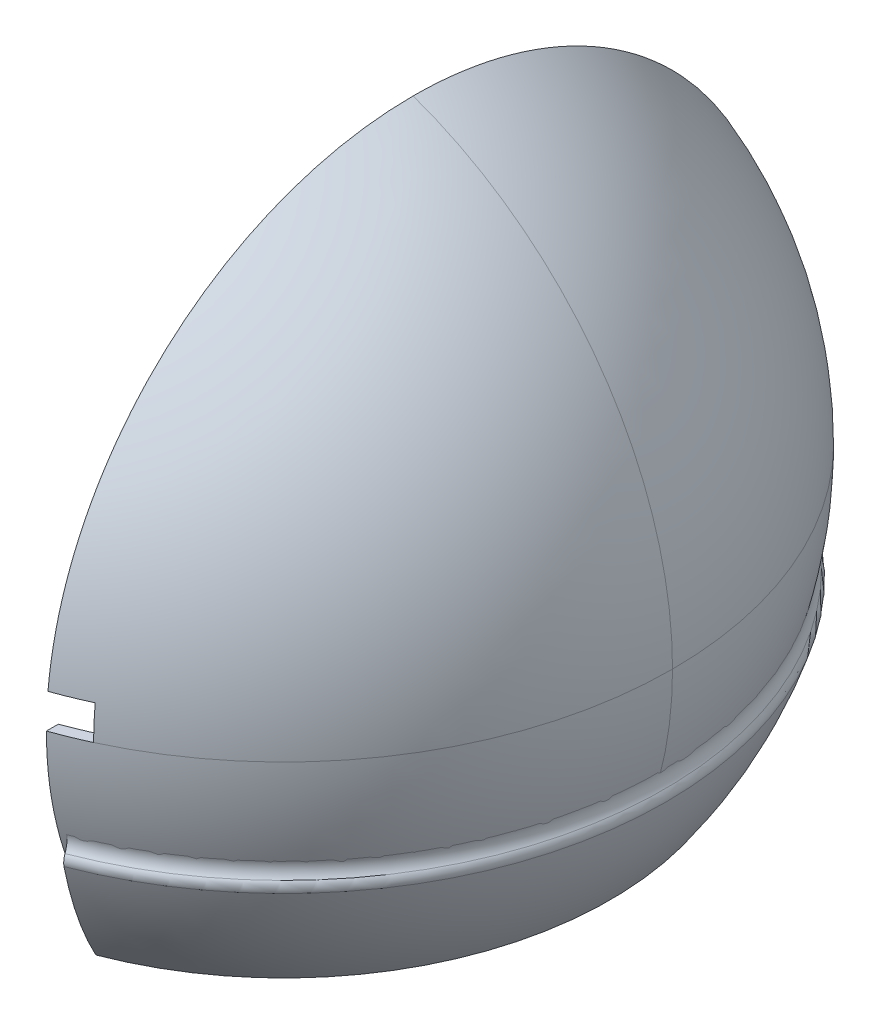
ISO-10303-21;
HEADER;
FILE_DESCRIPTION(('STEP AP214'),'2;1');
FILE_NAME('part.step','',(''),(''),'','','');
FILE_SCHEMA(('AUTOMOTIVE_DESIGN { 1 0 10303 214 1 1 1 1 }'));
ENDSEC;
DATA;
#1=APPLICATION_CONTEXT('core data for automotive mechanical design processes');
#2=APPLICATION_PROTOCOL_DEFINITION('international standard','automotive_design',2000,#1);
#3=PRODUCT_CONTEXT('',#1,'mechanical');
#4=PRODUCT('Part','Part','',(#3));
#5=PRODUCT_RELATED_PRODUCT_CATEGORY('part','',(#4));
#6=PRODUCT_DEFINITION_FORMATION('','',#4);
#7=PRODUCT_DEFINITION_CONTEXT('part definition',#1,'design');
#8=PRODUCT_DEFINITION('design','',#6,#7);
#9=PRODUCT_DEFINITION_SHAPE('','',#8);
#10=(LENGTH_UNIT() NAMED_UNIT(*) SI_UNIT(.MILLI.,.METRE.));
#11=(NAMED_UNIT(*) PLANE_ANGLE_UNIT() SI_UNIT($,.RADIAN.));
#12=(NAMED_UNIT(*) SI_UNIT($,.STERADIAN.) SOLID_ANGLE_UNIT());
#13=UNCERTAINTY_MEASURE_WITH_UNIT(LENGTH_MEASURE(1.E-05),#10,'distance_accuracy_value','');
#14=(GEOMETRIC_REPRESENTATION_CONTEXT(3) GLOBAL_UNCERTAINTY_ASSIGNED_CONTEXT((#13)) GLOBAL_UNIT_ASSIGNED_CONTEXT((#10,
#11,#12)) REPRESENTATION_CONTEXT('',''));
#15=CARTESIAN_POINT('',(0.,0.,0.));
#16=DIRECTION('',(0.,0.,1.));
#17=DIRECTION('',(1.,0.,0.));
#18=AXIS2_PLACEMENT_3D('',#15,#16,#17);
#19=CARTESIAN_POINT('',(0.,0.,0.));
#20=DIRECTION('',(0.,-1.,0.));
#21=DIRECTION('',(0.358367949545273,0.,-0.933580426497212));
#22=AXIS2_PLACEMENT_3D('',#19,#20,#21);
#23=SPHERICAL_SURFACE('',#22,69.5);
#24=CARTESIAN_POINT('',(0.,-40.1519259480426,0.));
#25=DIRECTION('',(0.,-1.,0.));
#26=DIRECTION('',(0.,0.,-1.));
#27=AXIS2_PLACEMENT_3D('',#24,#25,#26);
#28=CIRCLE('',#27,56.728060452151);
#29=CARTESIAN_POINT('',(20.3295187059177,-40.1519259480426,-52.9602068712788));
#30=VERTEX_POINT('',#29);
#31=CARTESIAN_POINT('',(20.3295187059177,-40.1519259480426,52.9602068712788));
#32=VERTEX_POINT('',#31);
#33=EDGE_CURVE('E109',#30,#32,#28,.T.);
#34=ORIENTED_EDGE('',*,*,#33,.T.);
#35=CARTESIAN_POINT('',(0.,0.,0.));
#36=DIRECTION('',(0.933580426497212,0.,-0.358367949545273));
#37=DIRECTION('',(0.358367949545273,0.,0.933580426497212));
#38=AXIS2_PLACEMENT_3D('',#35,#36,#37);
#39=CIRCLE('',#38,69.5);
#40=CARTESIAN_POINT('',(24.1654577946896,-16.8279248908308,62.953169844271));
#41=VERTEX_POINT('',#40);
#42=EDGE_CURVE('E97',#41,#32,#39,.T.);
#43=ORIENTED_EDGE('',*,*,#42,.F.);
#44=CARTESIAN_POINT('',(0.,-16.8279248908308,0.));
#45=DIRECTION('',(0.,-1.,0.));
#46=DIRECTION('',(0.,0.,-1.));
#47=AXIS2_PLACEMENT_3D('',#44,#45,#46);
#48=CIRCLE('',#47,67.4319727122717);
#49=CARTESIAN_POINT('',(24.1654577946896,-16.8279248908308,-62.953169844271));
#50=VERTEX_POINT('',#49);
#51=EDGE_CURVE('E132',#50,#41,#48,.T.);
#52=ORIENTED_EDGE('',*,*,#51,.F.);
#53=CARTESIAN_POINT('',(0.,0.,0.));
#54=DIRECTION('',(-0.933580426497212,0.,-0.358367949545273));
#55=DIRECTION('',(0.358367949545273,0.,-0.933580426497212));
#56=AXIS2_PLACEMENT_3D('',#53,#54,#55);
#57=CIRCLE('',#56,69.5);
#58=EDGE_CURVE('E111',#50,#30,#57,.T.);
#59=ORIENTED_EDGE('',*,*,#58,.T.);
#60=EDGE_LOOP('',(#34,#43,#52,#59));
#61=FACE_BOUND('',#60,.T.);
#62=ADVANCED_FACE('F53',(#61),#23,.F.);
#63=CARTESIAN_POINT('',(0.,-40.1519259480426,0.));
#64=DIRECTION('',(0.,-1.,0.));
#65=DIRECTION('',(0.,0.,-1.));
#66=AXIS2_PLACEMENT_3D('',#63,#64,#65);
#67=CONICAL_SURFACE('',#66,56.728060452151,0.954856916214975);
#68=CARTESIAN_POINT('',(0.,-41.3073770544612,0.));
#69=DIRECTION('',(0.,-1.,0.));
#70=DIRECTION('',(0.,0.,-1.));
#71=AXIS2_PLACEMENT_3D('',#68,#69,#70);
#72=CIRCLE('',#71,58.3605226234359);
#73=CARTESIAN_POINT('',(20.9145408269513,-41.3073770544612,-54.4842416013875));
#74=VERTEX_POINT('',#73);
#75=CARTESIAN_POINT('',(20.9145408269513,-41.3073770544612,54.4842416013875));
#76=VERTEX_POINT('',#75);
#77=EDGE_CURVE('E116',#74,#76,#72,.T.);
#78=ORIENTED_EDGE('',*,*,#77,.T.);
#79=DIRECTION('',(0.292511060516796,-0.577725553209265,0.762017365054359));
#80=VECTOR('',#79,1.);
#81=CARTESIAN_POINT('',(20.3295187059177,-40.1519259480427,52.9602068712788));
#82=LINE('',#81,#80);
#83=EDGE_CURVE('E101',#32,#76,#82,.T.);
#84=ORIENTED_EDGE('',*,*,#83,.F.);
#85=ORIENTED_EDGE('',*,*,#33,.F.);
#86=DIRECTION('',(0.292511060516796,-0.577725553209265,-0.762017365054359));
#87=VECTOR('',#86,1.);
#88=CARTESIAN_POINT('',(20.3295187059177,-40.1519259480427,-52.9602068712788));
#89=LINE('',#88,#87);
#90=EDGE_CURVE('E125',#30,#74,#89,.T.);
#91=ORIENTED_EDGE('',*,*,#90,.T.);
#92=EDGE_LOOP('',(#78,#84,#85,#91));
#93=FACE_BOUND('',#92,.T.);
#94=ADVANCED_FACE('F118',(#93),#67,.F.);
#95=CARTESIAN_POINT('',(0.,0.,0.));
#96=DIRECTION('',(0.,-1.,0.));
#97=DIRECTION('',(0.358367949545273,0.,-0.933580426497212));
#98=AXIS2_PLACEMENT_3D('',#95,#96,#97);
#99=SPHERICAL_SURFACE('',#98,71.5);
#100=CARTESIAN_POINT('',(0.,0.,0.));
#101=DIRECTION('',(0.933580426497212,0.,0.358367949545273));
#102=DIRECTION('',(-0.358367949545273,0.,0.933580426497212));
#103=AXIS2_PLACEMENT_3D('',#100,#101,#102);
#104=CIRCLE('',#103,71.5);
#105=CARTESIAN_POINT('',(24.4694732451505,-21.2143775894294,-63.7451571697645));
#106=VERTEX_POINT('',#105);
#107=EDGE_CURVE('E127',#74,#106,#104,.T.);
#108=ORIENTED_EDGE('',*,*,#107,.T.);
#109=CARTESIAN_POINT('',(0.,-21.2143775894294,0.));
#110=DIRECTION('',(0.,1.,0.));
#111=DIRECTION('',(0.,0.,1.));
#112=AXIS2_PLACEMENT_3D('',#109,#110,#111);
#113=CIRCLE('',#112,68.2803059709981);
#114=CARTESIAN_POINT('',(24.4694732451505,-21.2143775894294,63.7451571697645));
#115=VERTEX_POINT('',#114);
#116=EDGE_CURVE('E115',#106,#115,#113,.F.);
#117=ORIENTED_EDGE('',*,*,#116,.T.);
#118=CARTESIAN_POINT('',(0.,0.,0.));
#119=DIRECTION('',(-0.933580426497212,0.,0.358367949545273));
#120=DIRECTION('',(-0.358367949545273,0.,-0.933580426497212));
#121=AXIS2_PLACEMENT_3D('',#118,#119,#120);
#122=CIRCLE('',#121,71.5);
#123=EDGE_CURVE('E119',#76,#115,#122,.T.);
#124=ORIENTED_EDGE('',*,*,#123,.F.);
#125=ORIENTED_EDGE('',*,*,#77,.F.);
#126=EDGE_LOOP('',(#108,#117,#124,#125));
#127=FACE_BOUND('',#126,.T.);
#128=ADVANCED_FACE('F139',(#127),#99,.T.);
#129=CARTESIAN_POINT('',(0.,-17.56609752028,0.));
#130=DIRECTION('',(0.,-1.,0.));
#131=DIRECTION('',(0.,0.,-1.));
#132=AXIS2_PLACEMENT_3D('',#129,#130,#131);
#133=TOROIDAL_SURFACE('',#132,70.3899391239881,3.04868235861166);
#134=CARTESIAN_POINT('',(25.2254981524802,-17.56609752028,65.7146693884856));
#135=DIRECTION('',(0.933580426497212,0.,-0.358367949545273));
#136=DIRECTION('',(-0.358367949545273,0.,-0.933580426497212));
#137=AXIS2_PLACEMENT_3D('',#134,#135,#136);
#138=CIRCLE('',#137,3.04868235861166);
#139=CARTESIAN_POINT('',(24.355650730605,-19.410802807093,63.4486393818062));
#140=VERTEX_POINT('',#139);
#141=EDGE_CURVE('E103',#140,#41,#138,.T.);
#142=ORIENTED_EDGE('',*,*,#141,.F.);
#143=CARTESIAN_POINT('',(0.,-19.4108028070928,0.));
#144=DIRECTION('',(0.,1.,0.));
#145=DIRECTION('',(0.,0.,1.));
#146=AXIS2_PLACEMENT_3D('',#143,#144,#145);
#147=CIRCLE('',#146,67.9626924269025);
#148=CARTESIAN_POINT('',(24.355650730605,-19.410802807093,-63.4486393818062));
#149=VERTEX_POINT('',#148);
#150=EDGE_CURVE('E61',#140,#149,#147,.T.);
#151=ORIENTED_EDGE('',*,*,#150,.T.);
#152=CARTESIAN_POINT('',(25.2254981524802,-17.56609752028,-65.7146693884856));
#153=DIRECTION('',(-0.933580426497212,0.,-0.358367949545273));
#154=DIRECTION('',(-0.358367949545273,0.,0.933580426497212));
#155=AXIS2_PLACEMENT_3D('',#152,#153,#154);
#156=CIRCLE('',#155,3.04868235861166);
#157=EDGE_CURVE('E130',#149,#50,#156,.T.);
#158=ORIENTED_EDGE('',*,*,#157,.T.);
#159=ORIENTED_EDGE('',*,*,#51,.T.);
#160=EDGE_LOOP('',(#142,#151,#158,#159));
#161=FACE_BOUND('',#160,.T.);
#162=ADVANCED_FACE('F145',(#161),#133,.F.);
#163=CARTESIAN_POINT('',(0.,0.,0.));
#164=DIRECTION('',(0.933580426497212,0.,0.358367949545273));
#165=DIRECTION('',(0.358367949545273,0.,-0.933580426497212));
#166=AXIS2_PLACEMENT_3D('',#163,#164,#165);
#167=PLANE('',#166);
#168=ORIENTED_EDGE('',*,*,#157,.F.);
#169=CARTESIAN_POINT('',(23.7850124550764,-20.6209684260888,-61.9620758503307));
#170=DIRECTION('',(0.933580426497212,0.,0.358367949545273));
#171=DIRECTION('',(0.358367949545273,0.,-0.933580426497212));
#172=AXIS2_PLACEMENT_3D('',#169,#170,#171);
#173=CIRCLE('',#172,2.);
#174=EDGE_CURVE('E12',#149,#106,#173,.F.);
#175=ORIENTED_EDGE('',*,*,#174,.T.);
#176=ORIENTED_EDGE('',*,*,#107,.F.);
#177=ORIENTED_EDGE('',*,*,#90,.F.);
#178=ORIENTED_EDGE('',*,*,#58,.F.);
#179=EDGE_LOOP('',(#168,#175,#176,#177,#178));
#180=FACE_BOUND('',#179,.T.);
#181=ADVANCED_FACE('F144',(#180),#167,.F.);
#182=CARTESIAN_POINT('',(0.,0.,0.));
#183=DIRECTION('',(-0.933580426497212,0.,0.358367949545273));
#184=DIRECTION('',(0.358367949545273,0.,0.933580426497212));
#185=AXIS2_PLACEMENT_3D('',#182,#183,#184);
#186=PLANE('',#185);
#187=ORIENTED_EDGE('',*,*,#123,.T.);
#188=CARTESIAN_POINT('',(23.7850124550764,-20.6209684260888,61.9620758503307));
#189=DIRECTION('',(-0.933580426497212,0.,0.358367949545273));
#190=DIRECTION('',(0.358367949545273,0.,0.933580426497212));
#191=AXIS2_PLACEMENT_3D('',#188,#189,#190);
#192=CIRCLE('',#191,2.);
#193=EDGE_CURVE('E75',#115,#140,#192,.T.);
#194=ORIENTED_EDGE('',*,*,#193,.T.);
#195=ORIENTED_EDGE('',*,*,#141,.T.);
#196=ORIENTED_EDGE('',*,*,#42,.T.);
#197=ORIENTED_EDGE('',*,*,#83,.T.);
#198=EDGE_LOOP('',(#187,#194,#195,#196,#197));
#199=FACE_BOUND('',#198,.T.);
#200=ADVANCED_FACE('F99',(#199),#186,.T.);
#201=CARTESIAN_POINT('',(0.,-20.6209684260888,0.));
#202=DIRECTION('',(0.,-1.,0.));
#203=DIRECTION('',(0.,0.,-1.));
#204=AXIS2_PLACEMENT_3D('',#201,#202,#203);
#205=TOROIDAL_SURFACE('',#204,66.3703673424389,2.);
#206=ORIENTED_EDGE('',*,*,#174,.F.);
#207=ORIENTED_EDGE('',*,*,#150,.F.);
#208=ORIENTED_EDGE('',*,*,#193,.F.);
#209=ORIENTED_EDGE('',*,*,#116,.F.);
#210=EDGE_LOOP('',(#206,#207,#208,#209));
#211=FACE_BOUND('',#210,.T.);
#212=ADVANCED_FACE('F55',(#211),#205,.T.);
#213=CLOSED_SHELL('',(#62,#94,#128,#162,#181,#200,#212));
#214=MANIFOLD_SOLID_BREP('B2',#213);
#215=CARTESIAN_POINT('',(23.12669879,63.4145551358409,376.658573777248));
#216=DIRECTION('',(1.,0.,0.));
#217=DIRECTION('',(0.,1.,0.));
#218=AXIS2_PLACEMENT_3D('',#215,#216,#217);
#219=PLANE('',#218);
#220=CARTESIAN_POINT('',(23.12669879,0.,0.));
#221=DIRECTION('',(1.,0.,0.));
#222=DIRECTION('',(0.,1.,0.));
#223=AXIS2_PLACEMENT_3D('',#220,#221,#222);
#224=CIRCLE('',#223,63.414555135841);
#225=CARTESIAN_POINT('',(23.12669879,-20.8431387079252,59.8913129917754));
#226=VERTEX_POINT('',#225);
#227=CARTESIAN_POINT('',(23.12669879,0.,63.414555135841));
#228=VERTEX_POINT('',#227);
#229=EDGE_CURVE('E331',#226,#228,#224,.F.);
#230=ORIENTED_EDGE('',*,*,#229,.F.);
#231=CARTESIAN_POINT('',(23.12669879,-20.8431387079252,59.8913129917754));
#232=CARTESIAN_POINT('',(23.12669879,-20.8680656284986,59.8826375742931));
#233=CARTESIAN_POINT('',(23.12669879,-20.8933429142004,59.8750029414941));
#234=CARTESIAN_POINT('',(23.12669879,-20.9444481619967,59.8618740909284));
#235=CARTESIAN_POINT('',(23.12669879,-20.9702761461037,59.8563799588921));
#236=CARTESIAN_POINT('',(23.12669879,-21.0482549369945,59.8432149104963));
#237=CARTESIAN_POINT('',(23.12669879,-21.1010004928081,59.8388265358631));
#238=CARTESIAN_POINT('',(23.12669879,-21.2064947949738,59.8390256959304));
#239=CARTESIAN_POINT('',(23.12669879,-21.2592435032381,59.8436211377766));
#240=CARTESIAN_POINT('',(23.12669879,-21.3632060592763,59.8616073338399));
#241=CARTESIAN_POINT('',(23.12669879,-21.4144203030802,59.8749957978593));
#242=CARTESIAN_POINT('',(23.12669879,-21.513933991144,59.9100561754452));
#243=CARTESIAN_POINT('',(23.12669879,-21.5622326124902,59.9317304150728));
#244=CARTESIAN_POINT('',(23.12669879,-21.6547064248714,59.9825878976033));
#245=CARTESIAN_POINT('',(23.12669879,-21.6988800442852,60.0117739867332));
#246=CARTESIAN_POINT('',(23.12669879,-21.7837457623825,60.0779823426161));
#247=CARTESIAN_POINT('',(23.12669879,-21.8242318334567,60.1152682718476));
#248=CARTESIAN_POINT('',(23.12669879,-21.8988179587026,60.195739810578));
#249=CARTESIAN_POINT('',(23.12669879,-21.9329173407773,60.238926040163));
#250=CARTESIAN_POINT('',(23.12669879,-21.9960547445567,60.3328692321022));
#251=CARTESIAN_POINT('',(23.12669879,-22.0246374289979,60.3839320011023));
#252=CARTESIAN_POINT('',(23.12669879,-22.0734025695672,60.4899387140656));
#253=CARTESIAN_POINT('',(23.12669879,-22.0935812868851,60.5448843727859));
#254=CARTESIAN_POINT('',(23.12669879,-22.1235268480908,60.6512445160946));
#255=CARTESIAN_POINT('',(23.12669879,-22.1341715091809,60.7024147606305));
#256=CARTESIAN_POINT('',(23.12669879,-22.148371731476,60.8056510367561));
#257=CARTESIAN_POINT('',(23.12669879,-22.1519380361129,60.8577155896292));
#258=CARTESIAN_POINT('',(23.12669879,-22.1519259480426,60.9097843680729));
#259=B_SPLINE_CURVE_WITH_KNOTS('',3,(#231,#232,#233,#234,#235,#236,#237,#238,#239,#240,#241,
#242,#243,#244,#245,#246,#247,#248,#249,#250,#251,#252,#253,#254,#255,#256,#257,#258),
.UNSPECIFIED.,.F.,.F.,(4,2,2,2,2,2,2,2,2,2,2,2,2,4),(0.,0.0791344135977732,0.158271996327442,
0.316233788838244,0.474334674711824,0.632394398539531,0.790498527005648,0.948662649273955,
1.11306485002964,1.27748434178042,1.45228212659569,1.62715759370095,1.78347097047597,
1.93954691498167),.UNSPECIFIED.);
#260=CARTESIAN_POINT('',(23.12669879,-22.1519259480426,60.9097843680729));
#261=VERTEX_POINT('',#260);
#262=EDGE_CURVE('E379',#226,#261,#259,.T.);
#263=ORIENTED_EDGE('',*,*,#262,.T.);
#264=DIRECTION('',(0.,0.,-1.));
#265=VECTOR('',#264,1.);
#266=CARTESIAN_POINT('',(23.12669879,-22.1519259480426,376.658573777248));
#267=LINE('',#266,#265);
#268=CARTESIAN_POINT('',(23.12669879,-22.1519259480426,61.6822339079013));
#269=VERTEX_POINT('',#268);
#270=EDGE_CURVE('E348',#269,#261,#267,.T.);
#271=ORIENTED_EDGE('',*,*,#270,.F.);
#272=CARTESIAN_POINT('',(23.12669879,0.,0.));
#273=DIRECTION('',(1.,0.,0.));
#274=DIRECTION('',(0.,1.,0.));
#275=AXIS2_PLACEMENT_3D('',#272,#273,#274);
#276=CIRCLE('',#275,65.5393454581034);
#277=CARTESIAN_POINT('',(23.12669879,0.,65.5393454581034));
#278=VERTEX_POINT('',#277);
#279=EDGE_CURVE('E361',#269,#278,#276,.F.);
#280=ORIENTED_EDGE('',*,*,#279,.T.);
#281=DIRECTION('',(0.,0.,-1.));
#282=VECTOR('',#281,1.);
#283=CARTESIAN_POINT('',(23.12669879,0.,93.));
#284=LINE('',#283,#282);
#285=EDGE_CURVE('E432',#278,#228,#284,.T.);
#286=ORIENTED_EDGE('',*,*,#285,.T.);
#287=EDGE_LOOP('',(#230,#263,#271,#280,#286));
#288=FACE_BOUND('',#287,.T.);
#289=ADVANCED_FACE('F206',(#288),#219,.F.);
#290=CARTESIAN_POINT('',(23.12669879,-22.1519259480426,-60.9097843680729));
#291=VERTEX_POINT('',#290);
#292=CARTESIAN_POINT('',(23.12669879,-22.1519259480426,-61.6822339079013));
#293=VERTEX_POINT('',#292);
#294=EDGE_CURVE('E347',#291,#293,#267,.T.);
#295=ORIENTED_EDGE('',*,*,#294,.F.);
#296=CARTESIAN_POINT('',(23.12669879,-22.1519259480426,-60.9097843680729));
#297=CARTESIAN_POINT('',(23.12669879,-22.1519580155447,-60.8463274250617));
#298=CARTESIAN_POINT('',(23.12669879,-22.1466478548119,-60.782861600929));
#299=CARTESIAN_POINT('',(23.12669879,-22.1255630646785,-60.6576020207629));
#300=CARTESIAN_POINT('',(23.12669879,-22.1097736516003,-60.5958107554904));
#301=CARTESIAN_POINT('',(23.12669879,-22.067928584895,-60.4757136730821));
#302=CARTESIAN_POINT('',(23.12669879,-22.0418616694201,-60.4174117604906));
#303=CARTESIAN_POINT('',(23.12669879,-21.9799911250807,-60.3062576147276));
#304=CARTESIAN_POINT('',(23.12669879,-21.9441949363568,-60.2534012596662));
#305=CARTESIAN_POINT('',(23.12669879,-21.8650415682848,-60.1566644245475));
#306=CARTESIAN_POINT('',(23.12669879,-21.8219845256205,-60.1125389627674));
#307=CARTESIAN_POINT('',(23.12669879,-21.7285989540969,-60.0327703563906));
#308=CARTESIAN_POINT('',(23.12669879,-21.6782720647782,-59.997125304025));
#309=CARTESIAN_POINT('',(23.12669879,-21.5754160134851,-59.9379189520929));
#310=CARTESIAN_POINT('',(23.12669879,-21.5232611292965,-59.9137073922745));
#311=CARTESIAN_POINT('',(23.12669879,-21.4154506679275,-59.8750275108515));
#312=CARTESIAN_POINT('',(23.12669879,-21.3597963530601,-59.8605556977271));
#313=CARTESIAN_POINT('',(23.12669879,-21.250183613576,-59.8425559351763));
#314=CARTESIAN_POINT('',(23.12669879,-21.196323147384,-59.838424643881));
#315=CARTESIAN_POINT('',(23.12669879,-21.088719688082,-59.8395188515431));
#316=CARTESIAN_POINT('',(23.12669879,-21.034976630993,-59.8447345003189));
#317=CARTESIAN_POINT('',(23.12669879,-20.9585147576885,-59.8588516629342));
#318=CARTESIAN_POINT('',(23.12669879,-20.9350736625599,-59.8641202285516));
#319=CARTESIAN_POINT('',(23.12669879,-20.888706253992,-59.8764133579995));
#320=CARTESIAN_POINT('',(23.12669879,-20.8657790087224,-59.8834344055013));
#321=CARTESIAN_POINT('',(23.12669879,-20.8431387079252,-59.8913129917754));
#322=B_SPLINE_CURVE_WITH_KNOTS('',3,(#296,#297,#298,#299,#300,#301,#302,#303,#304,#305,#306,
#307,#308,#309,#310,#311,#312,#313,#314,#315,#316,#317,#318,#319,#320,#321),.UNSPECIFIED.,.F.,
.F.,(4,2,2,2,2,2,2,2,2,2,2,2,4),(0.,0.190166911804206,0.380602674780414,0.571247695387348,
0.761747334711114,0.945737936365608,1.12968710792386,1.30129507703659,1.4728414950398,
1.63411732170714,1.79522328935018,1.86724323762139,1.93911982451902),.UNSPECIFIED.);
#323=CARTESIAN_POINT('',(23.12669879,-20.8431387079252,-59.8913129917754));
#324=VERTEX_POINT('',#323);
#325=EDGE_CURVE('E51',#291,#324,#322,.T.);
#326=ORIENTED_EDGE('',*,*,#325,.T.);
#327=CARTESIAN_POINT('',(23.12669879,0.,0.));
#328=DIRECTION('',(1.,0.,0.));
#329=DIRECTION('',(0.,1.,0.));
#330=AXIS2_PLACEMENT_3D('',#327,#328,#329);
#331=CIRCLE('',#330,63.414555135841);
#332=CARTESIAN_POINT('',(23.12669879,0.,-63.414555135841));
#333=VERTEX_POINT('',#332);
#334=EDGE_CURVE('E345',#333,#324,#331,.F.);
#335=ORIENTED_EDGE('',*,*,#334,.F.);
#336=CARTESIAN_POINT('',(23.12669879,0.,0.));
#337=DIRECTION('',(1.,0.,0.));
#338=DIRECTION('',(0.,1.,0.));
#339=AXIS2_PLACEMENT_3D('',#336,#337,#338);
#340=CIRCLE('',#339,63.414555135841);
#341=CARTESIAN_POINT('',(23.12669879,63.4145551358409,0.));
#342=VERTEX_POINT('',#341);
#343=EDGE_CURVE('E322',#342,#333,#340,.F.);
#344=ORIENTED_EDGE('',*,*,#343,.F.);
#345=CARTESIAN_POINT('',(23.12669879,0.,0.));
#346=DIRECTION('',(1.,0.,0.));
#347=DIRECTION('',(0.,1.,0.));
#348=AXIS2_PLACEMENT_3D('',#345,#346,#347);
#349=CIRCLE('',#348,63.414555135841);
#350=CARTESIAN_POINT('',(23.12669879,6.,63.1300705137941));
#351=VERTEX_POINT('',#350);
#352=EDGE_CURVE('E325',#351,#342,#349,.F.);
#353=ORIENTED_EDGE('',*,*,#352,.F.);
#354=DIRECTION('',(0.,0.,-1.));
#355=VECTOR('',#354,1.);
#356=CARTESIAN_POINT('',(23.12669879,6.,93.));
#357=LINE('',#356,#355);
#358=CARTESIAN_POINT('',(23.12669879,6.,65.2641233992813));
#359=VERTEX_POINT('',#358);
#360=EDGE_CURVE('E316',#359,#351,#357,.T.);
#361=ORIENTED_EDGE('',*,*,#360,.F.);
#362=CARTESIAN_POINT('',(23.12669879,0.,0.));
#363=DIRECTION('',(1.,0.,0.));
#364=DIRECTION('',(0.,1.,0.));
#365=AXIS2_PLACEMENT_3D('',#362,#363,#364);
#366=CIRCLE('',#365,65.5393454581034);
#367=CARTESIAN_POINT('',(23.12669879,65.5393454581033,0.));
#368=VERTEX_POINT('',#367);
#369=EDGE_CURVE('E321',#359,#368,#366,.F.);
#370=ORIENTED_EDGE('',*,*,#369,.T.);
#371=CARTESIAN_POINT('',(23.12669879,0.,0.));
#372=DIRECTION('',(1.,0.,0.));
#373=DIRECTION('',(0.,1.,0.));
#374=AXIS2_PLACEMENT_3D('',#371,#372,#373);
#375=CIRCLE('',#374,65.5393454581034);
#376=CARTESIAN_POINT('',(23.12669879,0.,-65.5393454581034));
#377=VERTEX_POINT('',#376);
#378=EDGE_CURVE('E363',#368,#377,#375,.F.);
#379=ORIENTED_EDGE('',*,*,#378,.T.);
#380=CARTESIAN_POINT('',(23.12669879,0.,0.));
#381=DIRECTION('',(1.,0.,0.));
#382=DIRECTION('',(0.,1.,0.));
#383=AXIS2_PLACEMENT_3D('',#380,#381,#382);
#384=CIRCLE('',#383,65.5393454581034);
#385=EDGE_CURVE('E366',#377,#293,#384,.F.);
#386=ORIENTED_EDGE('',*,*,#385,.T.);
#387=EDGE_LOOP('',(#295,#326,#335,#344,#353,#361,#370,#379,#386));
#388=FACE_BOUND('',#387,.T.);
#389=ADVANCED_FACE('F395',(#388),#219,.F.);
#390=CARTESIAN_POINT('',(0.,0.,0.));
#391=DIRECTION('',(0.,0.,1.));
#392=DIRECTION('',(1.,0.,0.));
#393=AXIS2_PLACEMENT_3D('',#390,#391,#392);
#394=SPHERICAL_SURFACE('',#393,69.5);
#395=CARTESIAN_POINT('',(0.,6.,0.));
#396=DIRECTION('',(0.,-1.,0.));
#397=DIRECTION('',(0.,0.,-1.));
#398=AXIS2_PLACEMENT_3D('',#395,#396,#397);
#399=CIRCLE('',#398,69.2405228172058);
#400=CARTESIAN_POINT('',(29.12669879,6.,62.8162830609756));
#401=VERTEX_POINT('',#400);
#402=EDGE_CURVE('E312',#359,#401,#399,.F.);
#403=ORIENTED_EDGE('',*,*,#402,.T.);
#404=CARTESIAN_POINT('',(29.12669879,0.,0.));
#405=DIRECTION('',(-1.,0.,0.));
#406=DIRECTION('',(0.,0.,1.));
#407=AXIS2_PLACEMENT_3D('',#404,#405,#406);
#408=CIRCLE('',#407,63.1021823520915);
#409=CARTESIAN_POINT('',(29.12669879,0.,63.1021823520915));
#410=VERTEX_POINT('',#409);
#411=EDGE_CURVE('E296',#401,#410,#408,.F.);
#412=ORIENTED_EDGE('',*,*,#411,.T.);
#413=CARTESIAN_POINT('',(0.,0.,0.));
#414=DIRECTION('',(0.,-1.,0.));
#415=DIRECTION('',(1.,0.,0.));
#416=AXIS2_PLACEMENT_3D('',#413,#414,#415);
#417=CIRCLE('',#416,69.5);
#418=CARTESIAN_POINT('',(69.5,0.,0.));
#419=VERTEX_POINT('',#418);
#420=EDGE_CURVE('E351',#419,#410,#417,.T.);
#421=ORIENTED_EDGE('',*,*,#420,.F.);
#422=CARTESIAN_POINT('',(0.,0.,0.));
#423=DIRECTION('',(0.,0.,1.));
#424=DIRECTION('',(1.,0.,0.));
#425=AXIS2_PLACEMENT_3D('',#422,#423,#424);
#426=CIRCLE('',#425,69.5);
#427=EDGE_CURVE('E354',#368,#419,#426,.F.);
#428=ORIENTED_EDGE('',*,*,#427,.F.);
#429=ORIENTED_EDGE('',*,*,#369,.F.);
#430=EDGE_LOOP('',(#403,#412,#421,#428,#429));
#431=FACE_BOUND('',#430,.T.);
#432=ADVANCED_FACE('F319',(#431),#394,.T.);
#433=CARTESIAN_POINT('',(0.,0.,0.));
#434=DIRECTION('',(0.,0.,1.));
#435=DIRECTION('',(1.,0.,0.));
#436=AXIS2_PLACEMENT_3D('',#433,#434,#435);
#437=SPHERICAL_SURFACE('',#436,67.5);
#438=CARTESIAN_POINT('',(29.12669879,0.,0.));
#439=DIRECTION('',(-1.,0.,0.));
#440=DIRECTION('',(0.,0.,1.));
#441=AXIS2_PLACEMENT_3D('',#438,#439,#440);
#442=CIRCLE('',#441,60.8924085383114);
#443=CARTESIAN_POINT('',(29.12669879,6.,60.596084177087));
#444=VERTEX_POINT('',#443);
#445=CARTESIAN_POINT('',(29.12669879,0.,60.8924085383114));
#446=VERTEX_POINT('',#445);
#447=EDGE_CURVE('E308',#444,#446,#442,.F.);
#448=ORIENTED_EDGE('',*,*,#447,.F.);
#449=CARTESIAN_POINT('',(0.,6.,0.));
#450=DIRECTION('',(0.,-1.,0.));
#451=DIRECTION('',(0.,0.,-1.));
#452=AXIS2_PLACEMENT_3D('',#449,#450,#451);
#453=CIRCLE('',#452,67.2328044930449);
#454=EDGE_CURVE('E315',#351,#444,#453,.F.);
#455=ORIENTED_EDGE('',*,*,#454,.F.);
#456=ORIENTED_EDGE('',*,*,#352,.T.);
#457=CARTESIAN_POINT('',(0.,0.,0.));
#458=DIRECTION('',(0.,0.,1.));
#459=DIRECTION('',(1.,0.,0.));
#460=AXIS2_PLACEMENT_3D('',#457,#458,#459);
#461=CIRCLE('',#460,67.5);
#462=CARTESIAN_POINT('',(67.5,0.,0.));
#463=VERTEX_POINT('',#462);
#464=EDGE_CURVE('E339',#342,#463,#461,.F.);
#465=ORIENTED_EDGE('',*,*,#464,.T.);
#466=CARTESIAN_POINT('',(0.,0.,0.));
#467=DIRECTION('',(0.,1.,0.));
#468=DIRECTION('',(-1.,0.,0.));
#469=AXIS2_PLACEMENT_3D('',#466,#467,#468);
#470=CIRCLE('',#469,67.5);
#471=EDGE_CURVE('E342',#463,#446,#470,.F.);
#472=ORIENTED_EDGE('',*,*,#471,.T.);
#473=EDGE_LOOP('',(#448,#455,#456,#465,#472));
#474=FACE_BOUND('',#473,.T.);
#475=ADVANCED_FACE('F422',(#474),#437,.F.);
#476=CARTESIAN_POINT('',(23.12669879,-22.1519259480426,376.658573777248));
#477=DIRECTION('',(0.,1.,0.));
#478=DIRECTION('',(0.,0.,1.));
#479=AXIS2_PLACEMENT_3D('',#476,#477,#478);
#480=PLANE('',#479);
#481=ORIENTED_EDGE('',*,*,#270,.T.);
#482=CARTESIAN_POINT('',(0.,-22.1519259480426,0.));
#483=DIRECTION('',(0.,1.,0.));
#484=DIRECTION('',(0.,0.,1.));
#485=AXIS2_PLACEMENT_3D('',#482,#483,#484);
#486=CIRCLE('',#485,65.1524829050169);
#487=CARTESIAN_POINT('',(65.1524829050169,-22.1519259480426,0.));
#488=VERTEX_POINT('',#487);
#489=EDGE_CURVE('E229',#261,#488,#486,.T.);
#490=ORIENTED_EDGE('',*,*,#489,.T.);
#491=CARTESIAN_POINT('',(0.,-22.1519259480426,0.));
#492=DIRECTION('',(0.,1.,0.));
#493=DIRECTION('',(0.,0.,1.));
#494=AXIS2_PLACEMENT_3D('',#491,#492,#493);
#495=CIRCLE('',#494,65.1524829050169);
#496=EDGE_CURVE('E386',#488,#291,#495,.T.);
#497=ORIENTED_EDGE('',*,*,#496,.T.);
#498=ORIENTED_EDGE('',*,*,#294,.T.);
#499=CARTESIAN_POINT('',(0.,-22.1519259480426,0.));
#500=DIRECTION('',(0.,1.,0.));
#501=DIRECTION('',(0.,0.,1.));
#502=AXIS2_PLACEMENT_3D('',#499,#500,#501);
#503=CIRCLE('',#502,65.8752015313231);
#504=CARTESIAN_POINT('',(65.8752015313231,-22.1519259480426,0.));
#505=VERTEX_POINT('',#504);
#506=EDGE_CURVE('E353',#293,#505,#503,.F.);
#507=ORIENTED_EDGE('',*,*,#506,.T.);
#508=CARTESIAN_POINT('',(0.,-22.1519259480426,0.));
#509=DIRECTION('',(0.,1.,0.));
#510=DIRECTION('',(0.,0.,1.));
#511=AXIS2_PLACEMENT_3D('',#508,#509,#510);
#512=CIRCLE('',#511,65.8752015313231);
#513=EDGE_CURVE('E350',#505,#269,#512,.F.);
#514=ORIENTED_EDGE('',*,*,#513,.T.);
#515=EDGE_LOOP('',(#481,#490,#497,#498,#507,#514));
#516=FACE_BOUND('',#515,.T.);
#517=ADVANCED_FACE('F397',(#516),#480,.F.);
#518=CARTESIAN_POINT('',(0.,0.,0.));
#519=DIRECTION('',(0.,0.,1.));
#520=DIRECTION('',(1.,0.,0.));
#521=AXIS2_PLACEMENT_3D('',#518,#519,#520);
#522=SPHERICAL_SURFACE('',#521,69.5);
#523=ORIENTED_EDGE('',*,*,#279,.F.);
#524=ORIENTED_EDGE('',*,*,#513,.F.);
#525=CARTESIAN_POINT('',(0.,0.,0.));
#526=DIRECTION('',(0.,0.,1.));
#527=DIRECTION('',(0.,-1.,0.));
#528=AXIS2_PLACEMENT_3D('',#525,#526,#527);
#529=CIRCLE('',#528,69.5);
#530=EDGE_CURVE('E356',#419,#505,#529,.F.);
#531=ORIENTED_EDGE('',*,*,#530,.F.);
#532=ORIENTED_EDGE('',*,*,#420,.T.);
#533=CARTESIAN_POINT('',(0.,0.,0.));
#534=DIRECTION('',(0.,1.,0.));
#535=DIRECTION('',(-1.,0.,0.));
#536=AXIS2_PLACEMENT_3D('',#533,#534,#535);
#537=CIRCLE('',#536,69.5);
#538=EDGE_CURVE('E307',#410,#278,#537,.F.);
#539=ORIENTED_EDGE('',*,*,#538,.T.);
#540=EDGE_LOOP('',(#523,#524,#531,#532,#539));
#541=FACE_BOUND('',#540,.T.);
#542=ADVANCED_FACE('F439',(#541),#522,.T.);
#543=CARTESIAN_POINT('',(0.,0.,0.));
#544=DIRECTION('',(0.,1.,0.));
#545=DIRECTION('',(-1.,0.,0.));
#546=AXIS2_PLACEMENT_3D('',#543,#544,#545);
#547=SPHERICAL_SURFACE('',#546,69.5);
#548=ORIENTED_EDGE('',*,*,#378,.F.);
#549=ORIENTED_EDGE('',*,*,#427,.T.);
#550=CARTESIAN_POINT('',(0.,0.,0.));
#551=DIRECTION('',(0.,-1.,0.));
#552=DIRECTION('',(1.,0.,0.));
#553=AXIS2_PLACEMENT_3D('',#550,#551,#552);
#554=CIRCLE('',#553,69.5);
#555=EDGE_CURVE('E358',#377,#419,#554,.T.);
#556=ORIENTED_EDGE('',*,*,#555,.F.);
#557=EDGE_LOOP('',(#548,#549,#556));
#558=FACE_BOUND('',#557,.T.);
#559=ADVANCED_FACE('F444',(#558),#547,.T.);
#560=CARTESIAN_POINT('',(0.,0.,0.));
#561=DIRECTION('',(1.,0.,0.));
#562=DIRECTION('',(0.,1.,0.));
#563=AXIS2_PLACEMENT_3D('',#560,#561,#562);
#564=SPHERICAL_SURFACE('',#563,69.5);
#565=ORIENTED_EDGE('',*,*,#385,.F.);
#566=ORIENTED_EDGE('',*,*,#555,.T.);
#567=ORIENTED_EDGE('',*,*,#530,.T.);
#568=ORIENTED_EDGE('',*,*,#506,.F.);
#569=EDGE_LOOP('',(#565,#566,#567,#568));
#570=FACE_BOUND('',#569,.T.);
#571=ADVANCED_FACE('F446',(#570),#564,.T.);
#572=CARTESIAN_POINT('',(0.,0.,0.));
#573=DIRECTION('',(0.,0.,1.));
#574=DIRECTION('',(1.,0.,0.));
#575=AXIS2_PLACEMENT_3D('',#572,#573,#574);
#576=SPHERICAL_SURFACE('',#575,67.5);
#577=CARTESIAN_POINT('',(0.,0.,0.));
#578=DIRECTION('',(0.,0.,1.));
#579=DIRECTION('',(1.,0.,0.));
#580=AXIS2_PLACEMENT_3D('',#577,#578,#579);
#581=CIRCLE('',#580,67.5);
#582=CARTESIAN_POINT('',(64.2013517677174,-20.8431387079252,0.));
#583=VERTEX_POINT('',#582);
#584=EDGE_CURVE('E336',#463,#583,#581,.F.);
#585=ORIENTED_EDGE('',*,*,#584,.T.);
#586=CARTESIAN_POINT('',(0.,-20.8431387079252,0.));
#587=DIRECTION('',(0.,1.,0.));
#588=DIRECTION('',(0.,0.,1.));
#589=AXIS2_PLACEMENT_3D('',#586,#587,#588);
#590=CIRCLE('',#589,64.2013517677174);
#591=EDGE_CURVE('E376',#583,#226,#590,.F.);
#592=ORIENTED_EDGE('',*,*,#591,.T.);
#593=ORIENTED_EDGE('',*,*,#229,.T.);
#594=EDGE_CURVE('E341',#446,#228,#470,.F.);
#595=ORIENTED_EDGE('',*,*,#594,.F.);
#596=ORIENTED_EDGE('',*,*,#471,.F.);
#597=EDGE_LOOP('',(#585,#592,#593,#595,#596));
#598=FACE_BOUND('',#597,.T.);
#599=ADVANCED_FACE('F417',(#598),#576,.F.);
#600=CARTESIAN_POINT('',(0.,0.,0.));
#601=DIRECTION('',(0.,1.,0.));
#602=DIRECTION('',(-1.,0.,0.));
#603=AXIS2_PLACEMENT_3D('',#600,#601,#602);
#604=SPHERICAL_SURFACE('',#603,67.5);
#605=ORIENTED_EDGE('',*,*,#343,.T.);
#606=CARTESIAN_POINT('',(0.,0.,0.));
#607=DIRECTION('',(0.,1.,0.));
#608=DIRECTION('',(-1.,0.,0.));
#609=AXIS2_PLACEMENT_3D('',#606,#607,#608);
#610=CIRCLE('',#609,67.5);
#611=EDGE_CURVE('E333',#333,#463,#610,.F.);
#612=ORIENTED_EDGE('',*,*,#611,.T.);
#613=ORIENTED_EDGE('',*,*,#464,.F.);
#614=EDGE_LOOP('',(#605,#612,#613));
#615=FACE_BOUND('',#614,.T.);
#616=ADVANCED_FACE('F427',(#615),#604,.F.);
#617=CARTESIAN_POINT('',(0.,0.,0.));
#618=DIRECTION('',(1.,0.,0.));
#619=DIRECTION('',(0.,1.,0.));
#620=AXIS2_PLACEMENT_3D('',#617,#618,#619);
#621=SPHERICAL_SURFACE('',#620,67.5);
#622=ORIENTED_EDGE('',*,*,#334,.T.);
#623=CARTESIAN_POINT('',(0.,-20.8431387079252,0.));
#624=DIRECTION('',(0.,1.,0.));
#625=DIRECTION('',(0.,0.,1.));
#626=AXIS2_PLACEMENT_3D('',#623,#624,#625);
#627=CIRCLE('',#626,64.2013517677174);
#628=EDGE_CURVE('E216',#324,#583,#627,.F.);
#629=ORIENTED_EDGE('',*,*,#628,.T.);
#630=ORIENTED_EDGE('',*,*,#584,.F.);
#631=ORIENTED_EDGE('',*,*,#611,.F.);
#632=EDGE_LOOP('',(#622,#629,#630,#631));
#633=FACE_BOUND('',#632,.T.);
#634=ADVANCED_FACE('F414',(#633),#621,.F.);
#635=CARTESIAN_POINT('',(23.12669879,6.,93.));
#636=DIRECTION('',(0.,-1.,0.));
#637=DIRECTION('',(0.,0.,-1.));
#638=AXIS2_PLACEMENT_3D('',#635,#636,#637);
#639=PLANE('',#638);
#640=ORIENTED_EDGE('',*,*,#360,.T.);
#641=ORIENTED_EDGE('',*,*,#454,.T.);
#642=DIRECTION('',(0.,0.,-1.));
#643=VECTOR('',#642,1.);
#644=CARTESIAN_POINT('',(29.12669879,6.,93.));
#645=LINE('',#644,#643);
#646=EDGE_CURVE('E300',#401,#444,#645,.T.);
#647=ORIENTED_EDGE('',*,*,#646,.F.);
#648=ORIENTED_EDGE('',*,*,#402,.F.);
#649=EDGE_LOOP('',(#640,#641,#647,#648));
#650=FACE_BOUND('',#649,.T.);
#651=ADVANCED_FACE('F311',(#650),#639,.T.);
#652=CARTESIAN_POINT('',(23.12669879,0.,93.));
#653=DIRECTION('',(0.,1.,0.));
#654=DIRECTION('',(-1.,0.,0.));
#655=AXIS2_PLACEMENT_3D('',#652,#653,#654);
#656=PLANE('',#655);
#657=DIRECTION('',(0.,0.,-1.));
#658=VECTOR('',#657,1.);
#659=CARTESIAN_POINT('',(29.12669879,0.,93.));
#660=LINE('',#659,#658);
#661=EDGE_CURVE('E302',#410,#446,#660,.T.);
#662=ORIENTED_EDGE('',*,*,#661,.T.);
#663=ORIENTED_EDGE('',*,*,#594,.T.);
#664=ORIENTED_EDGE('',*,*,#285,.F.);
#665=ORIENTED_EDGE('',*,*,#538,.F.);
#666=EDGE_LOOP('',(#662,#663,#664,#665));
#667=FACE_BOUND('',#666,.T.);
#668=ADVANCED_FACE('F437',(#667),#656,.T.);
#669=CARTESIAN_POINT('',(29.12669879,0.,93.));
#670=DIRECTION('',(-1.,0.,0.));
#671=DIRECTION('',(0.,0.,1.));
#672=AXIS2_PLACEMENT_3D('',#669,#670,#671);
#673=PLANE('',#672);
#674=ORIENTED_EDGE('',*,*,#646,.T.);
#675=ORIENTED_EDGE('',*,*,#447,.T.);
#676=ORIENTED_EDGE('',*,*,#661,.F.);
#677=ORIENTED_EDGE('',*,*,#411,.F.);
#678=EDGE_LOOP('',(#674,#675,#676,#677));
#679=FACE_BOUND('',#678,.T.);
#680=ADVANCED_FACE('F298',(#679),#673,.T.);
#681=CARTESIAN_POINT('',(0.,-21.1519259480426,0.));
#682=DIRECTION('',(0.,1.,0.));
#683=DIRECTION('',(0.,0.,1.));
#684=AXIS2_PLACEMENT_3D('',#681,#682,#683);
#685=TOROIDAL_SURFACE('',#684,65.1524829050169,1.);
#686=ORIENTED_EDGE('',*,*,#325,.F.);
#687=ORIENTED_EDGE('',*,*,#496,.F.);
#688=CARTESIAN_POINT('',(65.1524829050169,-21.1519259480426,0.));
#689=DIRECTION('',(0.,0.,1.));
#690=DIRECTION('',(1.,0.,0.));
#691=AXIS2_PLACEMENT_3D('',#688,#689,#690);
#692=CIRCLE('',#691,1.);
#693=EDGE_CURVE('E211',#583,#488,#692,.T.);
#694=ORIENTED_EDGE('',*,*,#693,.F.);
#695=ORIENTED_EDGE('',*,*,#628,.F.);
#696=EDGE_LOOP('',(#686,#687,#694,#695));
#697=FACE_BOUND('',#696,.T.);
#698=ADVANCED_FACE('F208',(#697),#685,.T.);
#699=CARTESIAN_POINT('',(0.,-21.1519259480426,0.));
#700=DIRECTION('',(0.,1.,0.));
#701=DIRECTION('',(0.,0.,1.));
#702=AXIS2_PLACEMENT_3D('',#699,#700,#701);
#703=TOROIDAL_SURFACE('',#702,65.1524829050169,1.);
#704=ORIENTED_EDGE('',*,*,#693,.T.);
#705=ORIENTED_EDGE('',*,*,#489,.F.);
#706=ORIENTED_EDGE('',*,*,#262,.F.);
#707=ORIENTED_EDGE('',*,*,#591,.F.);
#708=EDGE_LOOP('',(#704,#705,#706,#707));
#709=FACE_BOUND('',#708,.T.);
#710=ADVANCED_FACE('F388',(#709),#703,.T.);
#711=CLOSED_SHELL('',(#289,#389,#432,#475,#517,#542,#559,#571,#599,#616,#634,#651,#668,#680,
#698,#710));
#712=MANIFOLD_SOLID_BREP('B6',#711);
#713=ADVANCED_BREP_SHAPE_REPRESENTATION('',(#18,#214,#712),#14);
#714=SHAPE_DEFINITION_REPRESENTATION(#9,#713);
ENDSEC;
END-ISO-10303-21;
